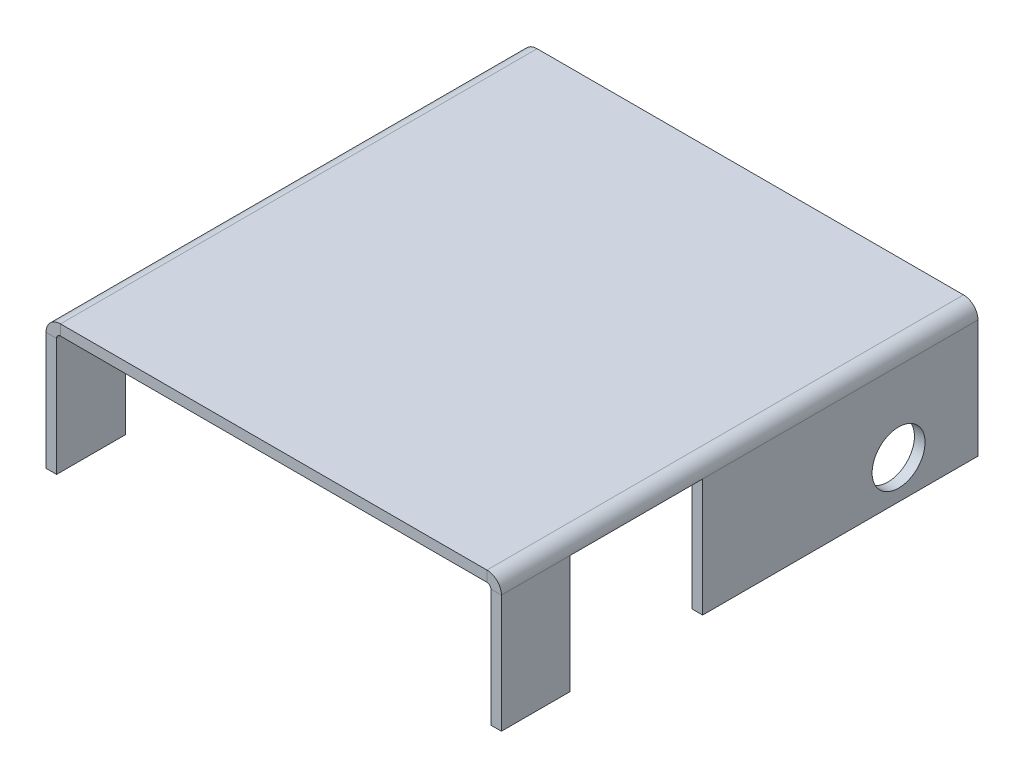
ISO-10303-21;
HEADER;
FILE_DESCRIPTION(('STEP AP214'),'2;1');
FILE_NAME('part.step','',(''),(''),'','','');
FILE_SCHEMA(('AUTOMOTIVE_DESIGN { 1 0 10303 214 1 1 1 1 }'));
ENDSEC;
DATA;
#1=APPLICATION_CONTEXT('core data for automotive mechanical design processes');
#2=APPLICATION_PROTOCOL_DEFINITION('international standard','automotive_design',2000,#1);
#3=PRODUCT_CONTEXT('',#1,'mechanical');
#4=PRODUCT('Part','Part','',(#3));
#5=PRODUCT_RELATED_PRODUCT_CATEGORY('part','',(#4));
#6=PRODUCT_DEFINITION_FORMATION('','',#4);
#7=PRODUCT_DEFINITION_CONTEXT('part definition',#1,'design');
#8=PRODUCT_DEFINITION('design','',#6,#7);
#9=PRODUCT_DEFINITION_SHAPE('','',#8);
#10=(LENGTH_UNIT() NAMED_UNIT(*) SI_UNIT(.MILLI.,.METRE.));
#11=(NAMED_UNIT(*) PLANE_ANGLE_UNIT() SI_UNIT($,.RADIAN.));
#12=(NAMED_UNIT(*) SI_UNIT($,.STERADIAN.) SOLID_ANGLE_UNIT());
#13=UNCERTAINTY_MEASURE_WITH_UNIT(LENGTH_MEASURE(1.E-05),#10,'distance_accuracy_value','');
#14=(GEOMETRIC_REPRESENTATION_CONTEXT(3) GLOBAL_UNCERTAINTY_ASSIGNED_CONTEXT((#13)) GLOBAL_UNIT_ASSIGNED_CONTEXT((#10,
#11,#12)) REPRESENTATION_CONTEXT('',''));
#15=CARTESIAN_POINT('',(0.,0.,0.));
#16=DIRECTION('',(0.,0.,1.));
#17=DIRECTION('',(1.,0.,0.));
#18=AXIS2_PLACEMENT_3D('',#15,#16,#17);
#19=CARTESIAN_POINT('',(90.0168743777956,3.32870375304922E-13,0.));
#20=DIRECTION('',(-1.,0.,0.));
#21=DIRECTION('',(0.,-1.,0.));
#22=AXIS2_PLACEMENT_3D('',#19,#20,#21);
#23=PLANE('',#22);
#24=CARTESIAN_POINT('',(90.0168743777957,-17.7366000000002,-75.0175246000337));
#25=DIRECTION('',(-1.,0.,0.));
#26=DIRECTION('',(0.,-1.,0.));
#27=AXIS2_PLACEMENT_3D('',#24,#25,#26);
#28=CIRCLE('',#27,5.);
#29=CARTESIAN_POINT('',(90.0168743777957,-22.7366000000002,-75.0175246000337));
#30=VERTEX_POINT('',#29);
#31=EDGE_CURVE('E855',#30,#30,#28,.T.);
#32=ORIENTED_EDGE('',*,*,#31,.T.);
#33=EDGE_LOOP('',(#32));
#34=FACE_BOUND('',#33,.T.);
#35=DIRECTION('',(0.,0.,1.));
#36=VECTOR('',#35,1.);
#37=CARTESIAN_POINT('',(90.0168743777956,-2.7366,-90.0175246000337));
#38=LINE('',#37,#36);
#39=CARTESIAN_POINT('',(90.0168743777956,-2.7366,-38.0175246000338));
#40=VERTEX_POINT('',#39);
#41=CARTESIAN_POINT('',(90.0168743777956,-2.7366,-90.0175246000337));
#42=VERTEX_POINT('',#41);
#43=EDGE_CURVE('E320',#40,#42,#38,.F.);
#44=ORIENTED_EDGE('',*,*,#43,.F.);
#45=DIRECTION('',(0.,1.,0.));
#46=VECTOR('',#45,1.);
#47=CARTESIAN_POINT('',(90.0168743777957,-25.,-38.0175246000338));
#48=LINE('',#47,#46);
#49=CARTESIAN_POINT('',(90.0168743777957,-25.,-38.0175246000338));
#50=VERTEX_POINT('',#49);
#51=EDGE_CURVE('E485',#50,#40,#48,.T.);
#52=ORIENTED_EDGE('',*,*,#51,.F.);
#53=DIRECTION('',(0.,0.,-1.));
#54=VECTOR('',#53,1.);
#55=CARTESIAN_POINT('',(90.0168743777957,-25.,0.));
#56=LINE('',#55,#54);
#57=CARTESIAN_POINT('',(90.0168743777957,-25.,-90.0175246000337));
#58=VERTEX_POINT('',#57);
#59=EDGE_CURVE('E305',#50,#58,#56,.T.);
#60=ORIENTED_EDGE('',*,*,#59,.T.);
#61=DIRECTION('',(0.,1.,0.));
#62=VECTOR('',#61,1.);
#63=CARTESIAN_POINT('',(90.0168743777956,3.32870375304922E-13,-90.0175246000337));
#64=LINE('',#63,#62);
#65=EDGE_CURVE('E299',#58,#42,#64,.T.);
#66=ORIENTED_EDGE('',*,*,#65,.T.);
#67=EDGE_LOOP('',(#44,#52,#60,#66));
#68=FACE_BOUND('',#67,.T.);
#69=ADVANCED_FACE('F77',(#34,#68),#23,.F.);
#70=CARTESIAN_POINT('',(88.0168743777956,3.25887412627236E-13,0.));
#71=DIRECTION('',(-1.,0.,0.));
#72=DIRECTION('',(0.,-1.,0.));
#73=AXIS2_PLACEMENT_3D('',#70,#71,#72);
#74=PLANE('',#73);
#75=CARTESIAN_POINT('',(88.0168743777956,-17.7366000000002,-75.0175246000337));
#76=DIRECTION('',(-1.,0.,0.));
#77=DIRECTION('',(0.,-1.,0.));
#78=AXIS2_PLACEMENT_3D('',#75,#76,#77);
#79=CIRCLE('',#78,5.);
#80=CARTESIAN_POINT('',(88.0168743777956,-22.7366000000002,-75.0175246000337));
#81=VERTEX_POINT('',#80);
#82=EDGE_CURVE('E486',#81,#81,#79,.T.);
#83=ORIENTED_EDGE('',*,*,#82,.F.);
#84=EDGE_LOOP('',(#83));
#85=FACE_BOUND('',#84,.T.);
#86=DIRECTION('',(0.,-1.,0.));
#87=VECTOR('',#86,1.);
#88=CARTESIAN_POINT('',(88.0168743777956,3.25887412627236E-13,-38.0175246000338));
#89=LINE('',#88,#87);
#90=CARTESIAN_POINT('',(88.0168743777956,-2.73660000000001,-38.0175246000338));
#91=VERTEX_POINT('',#90);
#92=CARTESIAN_POINT('',(88.0168743777957,-25.,-38.0175246000338));
#93=VERTEX_POINT('',#92);
#94=EDGE_CURVE('E421',#91,#93,#89,.T.);
#95=ORIENTED_EDGE('',*,*,#94,.F.);
#96=DIRECTION('',(0.,0.,1.));
#97=VECTOR('',#96,1.);
#98=CARTESIAN_POINT('',(88.0168743777956,-2.73660000000001,-90.0175246000337));
#99=LINE('',#98,#97);
#100=CARTESIAN_POINT('',(88.0168743777956,-2.73660000000001,-90.0175246000337));
#101=VERTEX_POINT('',#100);
#102=EDGE_CURVE('E324',#101,#91,#99,.T.);
#103=ORIENTED_EDGE('',*,*,#102,.F.);
#104=DIRECTION('',(0.,-1.,0.));
#105=VECTOR('',#104,1.);
#106=CARTESIAN_POINT('',(88.0168743777956,-2.,-90.0175246000337));
#107=LINE('',#106,#105);
#108=CARTESIAN_POINT('',(88.0168743777957,-25.,-90.0175246000337));
#109=VERTEX_POINT('',#108);
#110=EDGE_CURVE('E308',#109,#101,#107,.F.);
#111=ORIENTED_EDGE('',*,*,#110,.F.);
#112=DIRECTION('',(0.,0.,1.));
#113=VECTOR('',#112,1.);
#114=CARTESIAN_POINT('',(88.0168743777957,-25.,-90.0175246000337));
#115=LINE('',#114,#113);
#116=EDGE_CURVE('E314',#93,#109,#115,.F.);
#117=ORIENTED_EDGE('',*,*,#116,.F.);
#118=EDGE_LOOP('',(#95,#103,#111,#117));
#119=FACE_BOUND('',#118,.T.);
#120=ADVANCED_FACE('F419',(#85,#119),#74,.T.);
#121=CARTESIAN_POINT('',(90.0168743777957,-25.,-90.0175246000337));
#122=DIRECTION('',(0.,1.,0.));
#123=DIRECTION('',(-1.,0.,0.));
#124=AXIS2_PLACEMENT_3D('',#121,#122,#123);
#125=PLANE('',#124);
#126=ORIENTED_EDGE('',*,*,#59,.F.);
#127=DIRECTION('',(1.,0.,0.));
#128=VECTOR('',#127,1.);
#129=CARTESIAN_POINT('',(4.01687437779551,-25.0000000000003,-38.0175246000337));
#130=LINE('',#129,#128);
#131=EDGE_CURVE('E430',#93,#50,#130,.T.);
#132=ORIENTED_EDGE('',*,*,#131,.F.);
#133=ORIENTED_EDGE('',*,*,#116,.T.);
#134=DIRECTION('',(-1.,0.,0.));
#135=VECTOR('',#134,1.);
#136=CARTESIAN_POINT('',(90.0168743777957,-25.,-90.0175246000337));
#137=LINE('',#136,#135);
#138=EDGE_CURVE('E296',#58,#109,#137,.T.);
#139=ORIENTED_EDGE('',*,*,#138,.F.);
#140=EDGE_LOOP('',(#126,#132,#133,#139));
#141=FACE_BOUND('',#140,.T.);
#142=ADVANCED_FACE('F428',(#141),#125,.F.);
#143=CARTESIAN_POINT('',(4.01687437779561,0.,0.));
#144=DIRECTION('',(1.,0.,0.));
#145=DIRECTION('',(0.,1.,0.));
#146=AXIS2_PLACEMENT_3D('',#143,#144,#145);
#147=PLANE('',#146);
#148=CARTESIAN_POINT('',(4.01687437779554,-17.7365999999999,-75.0175246000337));
#149=DIRECTION('',(-1.,0.,0.));
#150=DIRECTION('',(0.,-1.,0.));
#151=AXIS2_PLACEMENT_3D('',#148,#149,#150);
#152=CIRCLE('',#151,5.);
#153=CARTESIAN_POINT('',(4.01687437779552,-22.7365999999999,-75.0175246000337));
#154=VERTEX_POINT('',#153);
#155=EDGE_CURVE('E856',#154,#154,#152,.T.);
#156=ORIENTED_EDGE('',*,*,#155,.F.);
#157=EDGE_LOOP('',(#156));
#158=FACE_BOUND('',#157,.T.);
#159=DIRECTION('',(0.,0.,1.));
#160=VECTOR('',#159,1.);
#161=CARTESIAN_POINT('',(4.01687437779552,-25.,0.));
#162=LINE('',#161,#160);
#163=CARTESIAN_POINT('',(4.01687437779551,-25.,-90.0175246000337));
#164=VERTEX_POINT('',#163);
#165=CARTESIAN_POINT('',(4.01687437779551,-25.0000000000003,-38.0175246000337));
#166=VERTEX_POINT('',#165);
#167=EDGE_CURVE('E245',#164,#166,#162,.T.);
#168=ORIENTED_EDGE('',*,*,#167,.T.);
#169=DIRECTION('',(0.,1.,0.));
#170=VECTOR('',#169,1.);
#171=CARTESIAN_POINT('',(4.01687437779551,-25.0000000000003,-38.0175246000337));
#172=LINE('',#171,#170);
#173=CARTESIAN_POINT('',(4.01687437779542,-2.73660000000031,-38.0175246000337));
#174=VERTEX_POINT('',#173);
#175=EDGE_CURVE('E220',#166,#174,#172,.T.);
#176=ORIENTED_EDGE('',*,*,#175,.T.);
#177=DIRECTION('',(0.,0.,-1.));
#178=VECTOR('',#177,1.);
#179=CARTESIAN_POINT('',(4.0168743777956,-2.73659999999999,-0.0175246000337505));
#180=LINE('',#179,#178);
#181=CARTESIAN_POINT('',(4.01687437779559,-2.73659999999999,-90.0175246000337));
#182=VERTEX_POINT('',#181);
#183=EDGE_CURVE('E242',#182,#174,#180,.F.);
#184=ORIENTED_EDGE('',*,*,#183,.F.);
#185=DIRECTION('',(0.,-1.,0.));
#186=VECTOR('',#185,1.);
#187=CARTESIAN_POINT('',(4.0168743777956,0.,-90.0175246000337));
#188=LINE('',#187,#186);
#189=EDGE_CURVE('E457',#182,#164,#188,.T.);
#190=ORIENTED_EDGE('',*,*,#189,.T.);
#191=EDGE_LOOP('',(#168,#176,#184,#190));
#192=FACE_BOUND('',#191,.T.);
#193=ADVANCED_FACE('F241',(#158,#192),#147,.F.);
#194=CARTESIAN_POINT('',(6.01687437779561,0.,0.));
#195=DIRECTION('',(1.,0.,0.));
#196=DIRECTION('',(0.,1.,0.));
#197=AXIS2_PLACEMENT_3D('',#194,#195,#196);
#198=PLANE('',#197);
#199=CARTESIAN_POINT('',(6.01687437779554,-17.7365999999999,-75.0175246000337));
#200=DIRECTION('',(1.,0.,0.));
#201=DIRECTION('',(0.,1.,0.));
#202=AXIS2_PLACEMENT_3D('',#199,#200,#201);
#203=CIRCLE('',#202,5.);
#204=CARTESIAN_POINT('',(6.01687437779555,-12.7365999999999,-75.0175246000337));
#205=VERTEX_POINT('',#204);
#206=EDGE_CURVE('E81',#205,#205,#203,.T.);
#207=ORIENTED_EDGE('',*,*,#206,.F.);
#208=EDGE_LOOP('',(#207));
#209=FACE_BOUND('',#208,.T.);
#210=DIRECTION('',(0.,1.,0.));
#211=VECTOR('',#210,1.);
#212=CARTESIAN_POINT('',(6.0168743777956,0.,-38.0175246000337));
#213=LINE('',#212,#211);
#214=CARTESIAN_POINT('',(6.01687437779552,-25.0000000000003,-38.0175246000337));
#215=VERTEX_POINT('',#214);
#216=CARTESIAN_POINT('',(6.0168743777956,-2.7366000000003,-38.0175246000337));
#217=VERTEX_POINT('',#216);
#218=EDGE_CURVE('E223',#215,#217,#213,.T.);
#219=ORIENTED_EDGE('',*,*,#218,.F.);
#220=DIRECTION('',(0.,0.,-1.));
#221=VECTOR('',#220,1.);
#222=CARTESIAN_POINT('',(6.01687437779552,-25.,-0.0175246000337514));
#223=LINE('',#222,#221);
#224=CARTESIAN_POINT('',(6.01687437779551,-25.,-90.0175246000337));
#225=VERTEX_POINT('',#224);
#226=EDGE_CURVE('E461',#225,#215,#223,.F.);
#227=ORIENTED_EDGE('',*,*,#226,.F.);
#228=DIRECTION('',(0.,1.,0.));
#229=VECTOR('',#228,1.);
#230=CARTESIAN_POINT('',(6.01687437779551,-25.,-90.0175246000337));
#231=LINE('',#230,#229);
#232=CARTESIAN_POINT('',(6.0168743777956,-2.73659999999999,-90.0175246000337));
#233=VERTEX_POINT('',#232);
#234=EDGE_CURVE('E251',#233,#225,#231,.F.);
#235=ORIENTED_EDGE('',*,*,#234,.F.);
#236=DIRECTION('',(0.,0.,-1.));
#237=VECTOR('',#236,1.);
#238=CARTESIAN_POINT('',(6.0168743777956,-2.7366,-0.0175246000337507));
#239=LINE('',#238,#237);
#240=EDGE_CURVE('E264',#217,#233,#239,.T.);
#241=ORIENTED_EDGE('',*,*,#240,.F.);
#242=EDGE_LOOP('',(#219,#227,#235,#241));
#243=FACE_BOUND('',#242,.T.);
#244=ADVANCED_FACE('F656',(#209,#243),#198,.T.);
#245=CARTESIAN_POINT('',(4.01687437779552,-25.,-0.0175246000337511));
#246=DIRECTION('',(0.,1.,0.));
#247=DIRECTION('',(-1.,0.,0.));
#248=AXIS2_PLACEMENT_3D('',#245,#246,#247);
#249=PLANE('',#248);
#250=ORIENTED_EDGE('',*,*,#226,.T.);
#251=EDGE_CURVE('E434',#166,#215,#130,.T.);
#252=ORIENTED_EDGE('',*,*,#251,.F.);
#253=ORIENTED_EDGE('',*,*,#167,.F.);
#254=DIRECTION('',(1.,0.,0.));
#255=VECTOR('',#254,1.);
#256=CARTESIAN_POINT('',(4.01687437779551,-25.,-90.0175246000337));
#257=LINE('',#256,#255);
#258=EDGE_CURVE('E285',#164,#225,#257,.T.);
#259=ORIENTED_EDGE('',*,*,#258,.T.);
#260=EDGE_LOOP('',(#250,#252,#253,#259));
#261=FACE_BOUND('',#260,.T.);
#262=ADVANCED_FACE('F526',(#261),#249,.F.);
#263=CARTESIAN_POINT('',(0.,-2.,0.));
#264=DIRECTION('',(0.,1.,0.));
#265=DIRECTION('',(0.,0.,1.));
#266=AXIS2_PLACEMENT_3D('',#263,#264,#265);
#267=PLANE('',#266);
#268=DIRECTION('',(0.,0.,-1.));
#269=VECTOR('',#268,1.);
#270=CARTESIAN_POINT('',(6.75347437779559,-2.,-90.0175246000337));
#271=LINE('',#270,#269);
#272=CARTESIAN_POINT('',(6.75347437779559,-2.,-90.0175246000337));
#273=VERTEX_POINT('',#272);
#274=CARTESIAN_POINT('',(6.75347437779559,-2.,-0.0175246000337914));
#275=VERTEX_POINT('',#274);
#276=EDGE_CURVE('E280',#273,#275,#271,.F.);
#277=ORIENTED_EDGE('',*,*,#276,.F.);
#278=DIRECTION('',(-1.,0.,0.));
#279=VECTOR('',#278,1.);
#280=CARTESIAN_POINT('',(4.01687437779559,-2.,-90.0175246000338));
#281=LINE('',#280,#279);
#282=CARTESIAN_POINT('',(87.2802743777956,-2.00000000000002,-90.0175246000337));
#283=VERTEX_POINT('',#282);
#284=EDGE_CURVE('E13',#283,#273,#281,.T.);
#285=ORIENTED_EDGE('',*,*,#284,.F.);
#286=DIRECTION('',(0.,0.,1.));
#287=VECTOR('',#286,1.);
#288=CARTESIAN_POINT('',(87.2802743777956,-2.00000000000002,-0.0175246000337498));
#289=LINE('',#288,#287);
#290=CARTESIAN_POINT('',(87.2802743777956,-2.00000000000002,-0.0175246000337497));
#291=VERTEX_POINT('',#290);
#292=EDGE_CURVE('E343',#291,#283,#289,.F.);
#293=ORIENTED_EDGE('',*,*,#292,.F.);
#294=DIRECTION('',(1.,0.,0.));
#295=VECTOR('',#294,1.);
#296=CARTESIAN_POINT('',(4.0168743777956,-2.,-0.0175246000337498));
#297=LINE('',#296,#295);
#298=EDGE_CURVE('E86',#275,#291,#297,.T.);
#299=ORIENTED_EDGE('',*,*,#298,.F.);
#300=EDGE_LOOP('',(#277,#285,#293,#299));
#301=FACE_BOUND('',#300,.T.);
#302=ADVANCED_FACE('F376',(#301),#267,.F.);
#303=CARTESIAN_POINT('',(0.,0.,0.));
#304=DIRECTION('',(0.,1.,0.));
#305=DIRECTION('',(0.,0.,1.));
#306=AXIS2_PLACEMENT_3D('',#303,#304,#305);
#307=PLANE('',#306);
#308=DIRECTION('',(-1.,0.,0.));
#309=VECTOR('',#308,1.);
#310=CARTESIAN_POINT('',(4.01687437779559,0.,-90.0175246000338));
#311=LINE('',#310,#309);
#312=CARTESIAN_POINT('',(87.2802743777956,0.,-90.0175246000338));
#313=VERTEX_POINT('',#312);
#314=CARTESIAN_POINT('',(6.75347437779557,0.,-90.0175246000337));
#315=VERTEX_POINT('',#314);
#316=EDGE_CURVE('E353',#313,#315,#311,.T.);
#317=ORIENTED_EDGE('',*,*,#316,.T.);
#318=DIRECTION('',(0.,0.,-1.));
#319=VECTOR('',#318,1.);
#320=CARTESIAN_POINT('',(6.75347437779557,0.,-90.0175246000337));
#321=LINE('',#320,#319);
#322=CARTESIAN_POINT('',(6.75347437779559,0.,-0.0175246000337913));
#323=VERTEX_POINT('',#322);
#324=EDGE_CURVE('E269',#315,#323,#321,.F.);
#325=ORIENTED_EDGE('',*,*,#324,.T.);
#326=DIRECTION('',(1.,0.,0.));
#327=VECTOR('',#326,1.);
#328=CARTESIAN_POINT('',(4.0168743777956,0.,-0.0175246000337498));
#329=LINE('',#328,#327);
#330=CARTESIAN_POINT('',(87.2802743777956,0.,-0.0175246000337497));
#331=VERTEX_POINT('',#330);
#332=EDGE_CURVE('E350',#323,#331,#329,.T.);
#333=ORIENTED_EDGE('',*,*,#332,.T.);
#334=DIRECTION('',(0.,0.,1.));
#335=VECTOR('',#334,1.);
#336=CARTESIAN_POINT('',(87.2802743777956,0.,-0.0175246000337498));
#337=LINE('',#336,#335);
#338=EDGE_CURVE('E330',#331,#313,#337,.F.);
#339=ORIENTED_EDGE('',*,*,#338,.T.);
#340=EDGE_LOOP('',(#317,#325,#333,#339));
#341=FACE_BOUND('',#340,.T.);
#342=ADVANCED_FACE('F358',(#341),#307,.T.);
#343=CARTESIAN_POINT('',(4.01687437779559,-2.,-90.0175246000338));
#344=DIRECTION('',(0.,0.,-1.));
#345=DIRECTION('',(-1.,0.,0.));
#346=AXIS2_PLACEMENT_3D('',#343,#344,#345);
#347=PLANE('',#346);
#348=ORIENTED_EDGE('',*,*,#284,.T.);
#349=DIRECTION('',(0.,1.,0.));
#350=VECTOR('',#349,1.);
#351=CARTESIAN_POINT('',(6.75347437779559,-2.,-90.0175246000337));
#352=LINE('',#351,#350);
#353=EDGE_CURVE('E275',#273,#315,#352,.T.);
#354=ORIENTED_EDGE('',*,*,#353,.T.);
#355=ORIENTED_EDGE('',*,*,#316,.F.);
#356=DIRECTION('',(0.,1.,0.));
#357=VECTOR('',#356,1.);
#358=CARTESIAN_POINT('',(87.2802743777956,-2.00000000000002,-90.0175246000337));
#359=LINE('',#358,#357);
#360=EDGE_CURVE('E347',#283,#313,#359,.T.);
#361=ORIENTED_EDGE('',*,*,#360,.F.);
#362=EDGE_LOOP('',(#348,#354,#355,#361));
#363=FACE_BOUND('',#362,.T.);
#364=ADVANCED_FACE('F363',(#363),#347,.T.);
#365=CARTESIAN_POINT('',(4.0168743777956,-2.,-0.0175246000337498));
#366=DIRECTION('',(0.,0.,1.));
#367=DIRECTION('',(1.,0.,0.));
#368=AXIS2_PLACEMENT_3D('',#365,#366,#367);
#369=PLANE('',#368);
#370=DIRECTION('',(0.,1.,0.));
#371=VECTOR('',#370,1.);
#372=CARTESIAN_POINT('',(6.75347437779559,-2.,-0.0175246000337914));
#373=LINE('',#372,#371);
#374=EDGE_CURVE('E286',#275,#323,#373,.T.);
#375=ORIENTED_EDGE('',*,*,#374,.F.);
#376=ORIENTED_EDGE('',*,*,#298,.T.);
#377=DIRECTION('',(0.,1.,0.));
#378=VECTOR('',#377,1.);
#379=CARTESIAN_POINT('',(87.2802743777956,-2.00000000000002,-0.0175246000337497));
#380=LINE('',#379,#378);
#381=EDGE_CURVE('E337',#291,#331,#380,.T.);
#382=ORIENTED_EDGE('',*,*,#381,.T.);
#383=ORIENTED_EDGE('',*,*,#332,.F.);
#384=EDGE_LOOP('',(#375,#376,#382,#383));
#385=FACE_BOUND('',#384,.T.);
#386=ADVANCED_FACE('F79',(#385),#369,.T.);
#387=CARTESIAN_POINT('',(87.2802743777956,-2.73660000000001,-90.0175246000337));
#388=DIRECTION('',(0.,0.,-1.));
#389=DIRECTION('',(-1.,0.,0.));
#390=AXIS2_PLACEMENT_3D('',#387,#388,#389);
#391=PLANE('',#390);
#392=DIRECTION('',(-1.,0.,0.));
#393=VECTOR('',#392,1.);
#394=CARTESIAN_POINT('',(90.0168743777956,-2.7366,-90.0175246000337));
#395=LINE('',#394,#393);
#396=EDGE_CURVE('E289',#101,#42,#395,.F.);
#397=ORIENTED_EDGE('',*,*,#396,.F.);
#398=CARTESIAN_POINT('',(87.2802743777956,-2.73660000000001,-90.0175246000337));
#399=DIRECTION('',(0.,0.,1.));
#400=DIRECTION('',(1.,0.,0.));
#401=AXIS2_PLACEMENT_3D('',#398,#399,#400);
#402=CIRCLE('',#401,0.73659999999999);
#403=EDGE_CURVE('E340',#283,#101,#402,.F.);
#404=ORIENTED_EDGE('',*,*,#403,.F.);
#405=ORIENTED_EDGE('',*,*,#360,.T.);
#406=CARTESIAN_POINT('',(87.2802743777956,-2.73660000000001,-90.0175246000337));
#407=DIRECTION('',(0.,0.,1.));
#408=DIRECTION('',(1.,0.,0.));
#409=AXIS2_PLACEMENT_3D('',#406,#407,#408);
#410=CIRCLE('',#409,2.73659999999999);
#411=EDGE_CURVE('E333',#313,#42,#410,.F.);
#412=ORIENTED_EDGE('',*,*,#411,.T.);
#413=EDGE_LOOP('',(#397,#404,#405,#412));
#414=FACE_BOUND('',#413,.T.);
#415=ADVANCED_FACE('F414',(#414),#391,.T.);
#416=CARTESIAN_POINT('',(87.2802743777956,-2.73660000000001,-0.0175246000337497));
#417=DIRECTION('',(0.,0.,-1.));
#418=DIRECTION('',(-1.,0.,0.));
#419=AXIS2_PLACEMENT_3D('',#416,#417,#418);
#420=PLANE('',#419);
#421=CARTESIAN_POINT('',(87.2802743777956,-2.73660000000001,-0.0175246000337497));
#422=DIRECTION('',(0.,0.,1.));
#423=DIRECTION('',(1.,0.,0.));
#424=AXIS2_PLACEMENT_3D('',#421,#422,#423);
#425=CIRCLE('',#424,0.73659999999999);
#426=CARTESIAN_POINT('',(88.0168743777956,-2.73660000000001,-0.0175246000337497));
#427=VERTEX_POINT('',#426);
#428=EDGE_CURVE('E295',#427,#291,#425,.T.);
#429=ORIENTED_EDGE('',*,*,#428,.F.);
#430=DIRECTION('',(-1.,0.,0.));
#431=VECTOR('',#430,1.);
#432=CARTESIAN_POINT('',(88.0168743777956,-2.73660000000001,-0.0175246000337498));
#433=LINE('',#432,#431);
#434=CARTESIAN_POINT('',(90.0168743777956,-2.7366,-0.0175246000337499));
#435=VERTEX_POINT('',#434);
#436=EDGE_CURVE('E321',#427,#435,#433,.F.);
#437=ORIENTED_EDGE('',*,*,#436,.T.);
#438=CARTESIAN_POINT('',(87.2802743777956,-2.73660000000001,-0.0175246000337497));
#439=DIRECTION('',(0.,0.,1.));
#440=DIRECTION('',(1.,0.,0.));
#441=AXIS2_PLACEMENT_3D('',#438,#439,#440);
#442=CIRCLE('',#441,2.73659999999999);
#443=EDGE_CURVE('E334',#435,#331,#442,.T.);
#444=ORIENTED_EDGE('',*,*,#443,.T.);
#445=ORIENTED_EDGE('',*,*,#381,.F.);
#446=EDGE_LOOP('',(#429,#437,#444,#445));
#447=FACE_BOUND('',#446,.T.);
#448=ADVANCED_FACE('F383',(#447),#420,.F.);
#449=CARTESIAN_POINT('',(87.2802743777956,-2.73660000000001,-0.0175246000337498));
#450=DIRECTION('',(0.,0.,1.));
#451=DIRECTION('',(1.,0.,0.));
#452=AXIS2_PLACEMENT_3D('',#449,#450,#451);
#453=CYLINDRICAL_SURFACE('',#452,2.73659999999999);
#454=ORIENTED_EDGE('',*,*,#338,.F.);
#455=ORIENTED_EDGE('',*,*,#443,.F.);
#456=CARTESIAN_POINT('',(90.0168743777956,-2.7366,-13.0175246000337));
#457=VERTEX_POINT('',#456);
#458=EDGE_CURVE('E317',#435,#457,#38,.F.);
#459=ORIENTED_EDGE('',*,*,#458,.T.);
#460=DIRECTION('',(0.,0.,1.));
#461=VECTOR('',#460,1.);
#462=CARTESIAN_POINT('',(90.0168743777956,-2.7366,-38.0175246000338));
#463=LINE('',#462,#461);
#464=EDGE_CURVE('E411',#40,#457,#463,.T.);
#465=ORIENTED_EDGE('',*,*,#464,.F.);
#466=ORIENTED_EDGE('',*,*,#43,.T.);
#467=ORIENTED_EDGE('',*,*,#411,.F.);
#468=EDGE_LOOP('',(#454,#455,#459,#465,#466,#467));
#469=FACE_BOUND('',#468,.T.);
#470=ADVANCED_FACE('F409',(#469),#453,.T.);
#471=CARTESIAN_POINT('',(87.2802743777956,-2.73660000000001,-0.0175246000337498));
#472=DIRECTION('',(0.,0.,1.));
#473=DIRECTION('',(1.,0.,0.));
#474=AXIS2_PLACEMENT_3D('',#471,#472,#473);
#475=CYLINDRICAL_SURFACE('',#474,0.73659999999999);
#476=ORIENTED_EDGE('',*,*,#292,.T.);
#477=ORIENTED_EDGE('',*,*,#403,.T.);
#478=ORIENTED_EDGE('',*,*,#102,.T.);
#479=DIRECTION('',(0.,0.,-1.));
#480=VECTOR('',#479,1.);
#481=CARTESIAN_POINT('',(88.0168743777956,-2.73660000000001,0.));
#482=LINE('',#481,#480);
#483=CARTESIAN_POINT('',(88.0168743777956,-2.73660000000001,-13.0175246000337));
#484=VERTEX_POINT('',#483);
#485=EDGE_CURVE('E268',#484,#91,#482,.T.);
#486=ORIENTED_EDGE('',*,*,#485,.F.);
#487=EDGE_CURVE('E327',#484,#427,#99,.T.);
#488=ORIENTED_EDGE('',*,*,#487,.T.);
#489=ORIENTED_EDGE('',*,*,#428,.T.);
#490=EDGE_LOOP('',(#476,#477,#478,#486,#488,#489));
#491=FACE_BOUND('',#490,.T.);
#492=ADVANCED_FACE('F386',(#491),#475,.F.);
#493=CARTESIAN_POINT('',(90.0168743777957,-25.,-0.0175246000337495));
#494=DIRECTION('',(0.,0.,-1.));
#495=DIRECTION('',(-1.,0.,0.));
#496=AXIS2_PLACEMENT_3D('',#493,#494,#495);
#497=PLANE('',#496);
#498=ORIENTED_EDGE('',*,*,#436,.F.);
#499=DIRECTION('',(0.,1.,0.));
#500=VECTOR('',#499,1.);
#501=CARTESIAN_POINT('',(88.0168743777957,-25.,-0.0175246000337492));
#502=LINE('',#501,#500);
#503=CARTESIAN_POINT('',(88.0168743777957,-25.,-0.0175246000337495));
#504=VERTEX_POINT('',#503);
#505=EDGE_CURVE('E315',#427,#504,#502,.F.);
#506=ORIENTED_EDGE('',*,*,#505,.T.);
#507=DIRECTION('',(-1.,0.,0.));
#508=VECTOR('',#507,1.);
#509=CARTESIAN_POINT('',(90.0168743777957,-25.,-0.0175246000337498));
#510=LINE('',#509,#508);
#511=CARTESIAN_POINT('',(90.0168743777957,-25.,-0.0175246000337496));
#512=VERTEX_POINT('',#511);
#513=EDGE_CURVE('E292',#512,#504,#510,.T.);
#514=ORIENTED_EDGE('',*,*,#513,.F.);
#515=DIRECTION('',(0.,-1.,0.));
#516=VECTOR('',#515,1.);
#517=CARTESIAN_POINT('',(90.0168743777956,3.32870140383854E-13,-0.0175246000337498));
#518=LINE('',#517,#516);
#519=EDGE_CURVE('E306',#435,#512,#518,.T.);
#520=ORIENTED_EDGE('',*,*,#519,.F.);
#521=EDGE_LOOP('',(#498,#506,#514,#520));
#522=FACE_BOUND('',#521,.T.);
#523=ADVANCED_FACE('F398',(#522),#497,.F.);
#524=CARTESIAN_POINT('',(90.0168743777956,-1.99999999999999,-90.0175246000337));
#525=DIRECTION('',(0.,0.,1.));
#526=DIRECTION('',(1.,0.,0.));
#527=AXIS2_PLACEMENT_3D('',#524,#525,#526);
#528=PLANE('',#527);
#529=ORIENTED_EDGE('',*,*,#396,.T.);
#530=ORIENTED_EDGE('',*,*,#65,.F.);
#531=ORIENTED_EDGE('',*,*,#138,.T.);
#532=ORIENTED_EDGE('',*,*,#110,.T.);
#533=EDGE_LOOP('',(#529,#530,#531,#532));
#534=FACE_BOUND('',#533,.T.);
#535=ADVANCED_FACE('F423',(#534),#528,.F.);
#536=CARTESIAN_POINT('',(90.0168743777957,-25.,-13.0175246000337));
#537=VERTEX_POINT('',#536);
#538=EDGE_CURVE('E302',#512,#537,#56,.T.);
#539=ORIENTED_EDGE('',*,*,#538,.T.);
#540=DIRECTION('',(0.,-1.,0.));
#541=VECTOR('',#540,1.);
#542=CARTESIAN_POINT('',(90.0168743777957,-25.,-13.0175246000337));
#543=LINE('',#542,#541);
#544=EDGE_CURVE('E94',#457,#537,#543,.T.);
#545=ORIENTED_EDGE('',*,*,#544,.F.);
#546=ORIENTED_EDGE('',*,*,#458,.F.);
#547=ORIENTED_EDGE('',*,*,#519,.T.);
#548=EDGE_LOOP('',(#539,#545,#546,#547));
#549=FACE_BOUND('',#548,.T.);
#550=ADVANCED_FACE('F405',(#549),#23,.F.);
#551=DIRECTION('',(0.,1.,0.));
#552=VECTOR('',#551,1.);
#553=CARTESIAN_POINT('',(88.0168743777956,3.24873110879848E-13,-13.0175246000337));
#554=LINE('',#553,#552);
#555=CARTESIAN_POINT('',(88.0168743777957,-25.,-13.0175246000337));
#556=VERTEX_POINT('',#555);
#557=EDGE_CURVE('E395',#556,#484,#554,.T.);
#558=ORIENTED_EDGE('',*,*,#557,.F.);
#559=EDGE_CURVE('E311',#504,#556,#115,.F.);
#560=ORIENTED_EDGE('',*,*,#559,.F.);
#561=ORIENTED_EDGE('',*,*,#505,.F.);
#562=ORIENTED_EDGE('',*,*,#487,.F.);
#563=EDGE_LOOP('',(#558,#560,#561,#562));
#564=FACE_BOUND('',#563,.T.);
#565=ADVANCED_FACE('F393',(#564),#74,.T.);
#566=ORIENTED_EDGE('',*,*,#559,.T.);
#567=DIRECTION('',(1.,0.,0.));
#568=VECTOR('',#567,1.);
#569=CARTESIAN_POINT('',(4.01687437779551,-25.0000000000003,-13.0175246000337));
#570=LINE('',#569,#568);
#571=EDGE_CURVE('E403',#556,#537,#570,.T.);
#572=ORIENTED_EDGE('',*,*,#571,.T.);
#573=ORIENTED_EDGE('',*,*,#538,.F.);
#574=ORIENTED_EDGE('',*,*,#513,.T.);
#575=EDGE_LOOP('',(#566,#572,#573,#574));
#576=FACE_BOUND('',#575,.T.);
#577=ADVANCED_FACE('F402',(#576),#125,.F.);
#578=CARTESIAN_POINT('',(6.75347437779559,-2.7366,-0.0175246000337775));
#579=DIRECTION('',(0.,0.,1.));
#580=DIRECTION('',(1.,0.,0.));
#581=AXIS2_PLACEMENT_3D('',#578,#579,#580);
#582=PLANE('',#581);
#583=DIRECTION('',(1.,0.,0.));
#584=VECTOR('',#583,1.);
#585=CARTESIAN_POINT('',(4.0168743777956,-2.73659999999999,-0.0175246000337498));
#586=LINE('',#585,#584);
#587=CARTESIAN_POINT('',(6.0168743777956,-2.73659999999999,-0.0175246000337914));
#588=VERTEX_POINT('',#587);
#589=CARTESIAN_POINT('',(4.0168743777956,-2.73659999999999,-0.0175246000338192));
#590=VERTEX_POINT('',#589);
#591=EDGE_CURVE('E265',#588,#590,#586,.F.);
#592=ORIENTED_EDGE('',*,*,#591,.F.);
#593=CARTESIAN_POINT('',(6.75347437779559,-2.7366,-0.0175246000337775));
#594=DIRECTION('',(0.,0.,-1.));
#595=DIRECTION('',(-1.,0.,0.));
#596=AXIS2_PLACEMENT_3D('',#593,#594,#595);
#597=CIRCLE('',#596,0.736599999999994);
#598=EDGE_CURVE('E277',#275,#588,#597,.F.);
#599=ORIENTED_EDGE('',*,*,#598,.F.);
#600=ORIENTED_EDGE('',*,*,#374,.T.);
#601=CARTESIAN_POINT('',(6.75347437779559,-2.7366,-0.0175246000338192));
#602=DIRECTION('',(0.,0.,-1.));
#603=DIRECTION('',(-1.,0.,0.));
#604=AXIS2_PLACEMENT_3D('',#601,#602,#603);
#605=CIRCLE('',#604,2.73659999999999);
#606=EDGE_CURVE('E272',#323,#590,#605,.F.);
#607=ORIENTED_EDGE('',*,*,#606,.T.);
#608=EDGE_LOOP('',(#592,#599,#600,#607));
#609=FACE_BOUND('',#608,.T.);
#610=ADVANCED_FACE('F478',(#609),#582,.T.);
#611=CARTESIAN_POINT('',(6.75347437779559,-2.7366,-90.0175246000337));
#612=DIRECTION('',(0.,0.,1.));
#613=DIRECTION('',(1.,0.,0.));
#614=AXIS2_PLACEMENT_3D('',#611,#612,#613);
#615=PLANE('',#614);
#616=CARTESIAN_POINT('',(6.75347437779559,-2.7366,-90.0175246000337));
#617=DIRECTION('',(0.,0.,-1.));
#618=DIRECTION('',(-1.,0.,0.));
#619=AXIS2_PLACEMENT_3D('',#616,#617,#618);
#620=CIRCLE('',#619,0.736599999999994);
#621=EDGE_CURVE('E282',#233,#273,#620,.T.);
#622=ORIENTED_EDGE('',*,*,#621,.F.);
#623=DIRECTION('',(1.,0.,0.));
#624=VECTOR('',#623,1.);
#625=CARTESIAN_POINT('',(6.01687437779559,-2.73659999999999,-90.0175246000337));
#626=LINE('',#625,#624);
#627=EDGE_CURVE('E256',#233,#182,#626,.F.);
#628=ORIENTED_EDGE('',*,*,#627,.T.);
#629=CARTESIAN_POINT('',(6.75347437779559,-2.7366,-90.0175246000337));
#630=DIRECTION('',(0.,0.,-1.));
#631=DIRECTION('',(-1.,0.,0.));
#632=AXIS2_PLACEMENT_3D('',#629,#630,#631);
#633=CIRCLE('',#632,2.73659999999999);
#634=EDGE_CURVE('E249',#182,#315,#633,.T.);
#635=ORIENTED_EDGE('',*,*,#634,.T.);
#636=ORIENTED_EDGE('',*,*,#353,.F.);
#637=EDGE_LOOP('',(#622,#628,#635,#636));
#638=FACE_BOUND('',#637,.T.);
#639=ADVANCED_FACE('F367',(#638),#615,.F.);
#640=CARTESIAN_POINT('',(6.75347437779559,-2.7366,-90.0175246000337));
#641=DIRECTION('',(0.,0.,-1.));
#642=DIRECTION('',(-1.,0.,0.));
#643=AXIS2_PLACEMENT_3D('',#640,#641,#642);
#644=CYLINDRICAL_SURFACE('',#643,2.73659999999999);
#645=ORIENTED_EDGE('',*,*,#324,.F.);
#646=ORIENTED_EDGE('',*,*,#634,.F.);
#647=ORIENTED_EDGE('',*,*,#183,.T.);
#648=DIRECTION('',(0.,0.,1.));
#649=VECTOR('',#648,1.);
#650=CARTESIAN_POINT('',(4.01687437779542,-2.73660000000031,-38.0175246000337));
#651=LINE('',#650,#649);
#652=CARTESIAN_POINT('',(4.01687437779544,-2.73660000000031,-13.0175246000337));
#653=VERTEX_POINT('',#652);
#654=EDGE_CURVE('E230',#174,#653,#651,.T.);
#655=ORIENTED_EDGE('',*,*,#654,.T.);
#656=EDGE_CURVE('E252',#653,#590,#180,.F.);
#657=ORIENTED_EDGE('',*,*,#656,.T.);
#658=ORIENTED_EDGE('',*,*,#606,.F.);
#659=EDGE_LOOP('',(#645,#646,#647,#655,#657,#658));
#660=FACE_BOUND('',#659,.T.);
#661=ADVANCED_FACE('F247',(#660),#644,.T.);
#662=CARTESIAN_POINT('',(6.75347437779559,-2.7366,-90.0175246000337));
#663=DIRECTION('',(0.,0.,-1.));
#664=DIRECTION('',(-1.,0.,0.));
#665=AXIS2_PLACEMENT_3D('',#662,#663,#664);
#666=CYLINDRICAL_SURFACE('',#665,0.736599999999994);
#667=ORIENTED_EDGE('',*,*,#276,.T.);
#668=ORIENTED_EDGE('',*,*,#598,.T.);
#669=CARTESIAN_POINT('',(6.0168743777956,-2.7366000000003,-13.0175246000337));
#670=VERTEX_POINT('',#669);
#671=EDGE_CURVE('E260',#588,#670,#239,.T.);
#672=ORIENTED_EDGE('',*,*,#671,.T.);
#673=EDGE_CURVE('E263',#670,#217,#239,.T.);
#674=ORIENTED_EDGE('',*,*,#673,.T.);
#675=ORIENTED_EDGE('',*,*,#240,.T.);
#676=ORIENTED_EDGE('',*,*,#621,.T.);
#677=EDGE_LOOP('',(#667,#668,#672,#674,#675,#676));
#678=FACE_BOUND('',#677,.T.);
#679=ADVANCED_FACE('F371',(#678),#666,.F.);
#680=CARTESIAN_POINT('',(4.01687437779551,-25.,-90.0175246000337));
#681=DIRECTION('',(0.,0.,1.));
#682=DIRECTION('',(1.,0.,0.));
#683=AXIS2_PLACEMENT_3D('',#680,#681,#682);
#684=PLANE('',#683);
#685=ORIENTED_EDGE('',*,*,#627,.F.);
#686=ORIENTED_EDGE('',*,*,#234,.T.);
#687=ORIENTED_EDGE('',*,*,#258,.F.);
#688=ORIENTED_EDGE('',*,*,#189,.F.);
#689=EDGE_LOOP('',(#685,#686,#687,#688));
#690=FACE_BOUND('',#689,.T.);
#691=ADVANCED_FACE('F621',(#690),#684,.F.);
#692=CARTESIAN_POINT('',(4.0168743777956,-1.99999999999999,-0.0175246000337498));
#693=DIRECTION('',(0.,0.,-1.));
#694=DIRECTION('',(-1.,0.,0.));
#695=AXIS2_PLACEMENT_3D('',#692,#693,#694);
#696=PLANE('',#695);
#697=ORIENTED_EDGE('',*,*,#591,.T.);
#698=DIRECTION('',(0.,1.,0.));
#699=VECTOR('',#698,1.);
#700=CARTESIAN_POINT('',(4.01687437779561,0.,-0.0175246000337497));
#701=LINE('',#700,#699);
#702=CARTESIAN_POINT('',(4.01687437779552,-25.,-0.0175246000337511));
#703=VERTEX_POINT('',#702);
#704=EDGE_CURVE('E452',#703,#590,#701,.T.);
#705=ORIENTED_EDGE('',*,*,#704,.F.);
#706=DIRECTION('',(1.,0.,0.));
#707=VECTOR('',#706,1.);
#708=CARTESIAN_POINT('',(4.01687437779552,-25.,-0.0175246000337511));
#709=LINE('',#708,#707);
#710=CARTESIAN_POINT('',(6.01687437779552,-25.,-0.0175246000337514));
#711=VERTEX_POINT('',#710);
#712=EDGE_CURVE('E449',#703,#711,#709,.T.);
#713=ORIENTED_EDGE('',*,*,#712,.T.);
#714=DIRECTION('',(0.,-1.,0.));
#715=VECTOR('',#714,1.);
#716=CARTESIAN_POINT('',(6.0168743777956,-2.,-0.01752460003375));
#717=LINE('',#716,#715);
#718=EDGE_CURVE('E459',#711,#588,#717,.F.);
#719=ORIENTED_EDGE('',*,*,#718,.T.);
#720=EDGE_LOOP('',(#697,#705,#713,#719));
#721=FACE_BOUND('',#720,.T.);
#722=ADVANCED_FACE('F474',(#721),#696,.F.);
#723=ORIENTED_EDGE('',*,*,#656,.F.);
#724=DIRECTION('',(0.,-1.,0.));
#725=VECTOR('',#724,1.);
#726=CARTESIAN_POINT('',(4.01687437779551,-25.0000000000003,-13.0175246000337));
#727=LINE('',#726,#725);
#728=CARTESIAN_POINT('',(4.01687437779551,-25.0000000000003,-13.0175246000337));
#729=VERTEX_POINT('',#728);
#730=EDGE_CURVE('E236',#653,#729,#727,.T.);
#731=ORIENTED_EDGE('',*,*,#730,.T.);
#732=EDGE_CURVE('E456',#729,#703,#162,.T.);
#733=ORIENTED_EDGE('',*,*,#732,.T.);
#734=ORIENTED_EDGE('',*,*,#704,.T.);
#735=EDGE_LOOP('',(#723,#731,#733,#734));
#736=FACE_BOUND('',#735,.T.);
#737=ADVANCED_FACE('F481',(#736),#147,.F.);
#738=DIRECTION('',(0.,-1.,0.));
#739=VECTOR('',#738,1.);
#740=CARTESIAN_POINT('',(6.01687437779561,0.,-13.0175246000337));
#741=LINE('',#740,#739);
#742=CARTESIAN_POINT('',(6.01687437779552,-25.,-13.0175246000337));
#743=VERTEX_POINT('',#742);
#744=EDGE_CURVE('E102',#670,#743,#741,.T.);
#745=ORIENTED_EDGE('',*,*,#744,.F.);
#746=ORIENTED_EDGE('',*,*,#671,.F.);
#747=ORIENTED_EDGE('',*,*,#718,.F.);
#748=EDGE_CURVE('E254',#743,#711,#223,.F.);
#749=ORIENTED_EDGE('',*,*,#748,.F.);
#750=EDGE_LOOP('',(#745,#746,#747,#749));
#751=FACE_BOUND('',#750,.T.);
#752=ADVANCED_FACE('F476',(#751),#198,.T.);
#753=ORIENTED_EDGE('',*,*,#732,.F.);
#754=EDGE_CURVE('E435',#729,#743,#570,.T.);
#755=ORIENTED_EDGE('',*,*,#754,.T.);
#756=ORIENTED_EDGE('',*,*,#748,.T.);
#757=ORIENTED_EDGE('',*,*,#712,.F.);
#758=EDGE_LOOP('',(#753,#755,#756,#757));
#759=FACE_BOUND('',#758,.T.);
#760=ADVANCED_FACE('F469',(#759),#249,.F.);
#761=CARTESIAN_POINT('',(4.01687437779551,-25.0000000000003,-13.0175246000337));
#762=DIRECTION('',(0.,0.,1.));
#763=DIRECTION('',(1.,0.,0.));
#764=AXIS2_PLACEMENT_3D('',#761,#762,#763);
#765=PLANE('',#764);
#766=ORIENTED_EDGE('',*,*,#744,.T.);
#767=ORIENTED_EDGE('',*,*,#754,.F.);
#768=ORIENTED_EDGE('',*,*,#730,.F.);
#769=DIRECTION('',(1.,0.,0.));
#770=VECTOR('',#769,1.);
#771=CARTESIAN_POINT('',(4.01687437779544,-2.73660000000031,-13.0175246000337));
#772=LINE('',#771,#770);
#773=EDGE_CURVE('E232',#653,#670,#772,.T.);
#774=ORIENTED_EDGE('',*,*,#773,.T.);
#775=EDGE_LOOP('',(#766,#767,#768,#774));
#776=FACE_BOUND('',#775,.T.);
#777=ADVANCED_FACE('F664',(#776),#765,.F.);
#778=CARTESIAN_POINT('',(4.01687437779551,-25.0000000000003,-38.0175246000337));
#779=DIRECTION('',(0.,0.,-1.));
#780=DIRECTION('',(-1.,0.,0.));
#781=AXIS2_PLACEMENT_3D('',#778,#779,#780);
#782=PLANE('',#781);
#783=ORIENTED_EDGE('',*,*,#218,.T.);
#784=DIRECTION('',(1.,0.,0.));
#785=VECTOR('',#784,1.);
#786=CARTESIAN_POINT('',(4.01687437779542,-2.73660000000031,-38.0175246000337));
#787=LINE('',#786,#785);
#788=EDGE_CURVE('E216',#174,#217,#787,.T.);
#789=ORIENTED_EDGE('',*,*,#788,.F.);
#790=ORIENTED_EDGE('',*,*,#175,.F.);
#791=ORIENTED_EDGE('',*,*,#251,.T.);
#792=EDGE_LOOP('',(#783,#789,#790,#791));
#793=FACE_BOUND('',#792,.T.);
#794=ADVANCED_FACE('F218',(#793),#782,.F.);
#795=CARTESIAN_POINT('',(4.01687437779542,-2.73660000000031,-38.0175246000337));
#796=DIRECTION('',(0.,1.,0.));
#797=DIRECTION('',(-1.,0.,0.));
#798=AXIS2_PLACEMENT_3D('',#795,#796,#797);
#799=PLANE('',#798);
#800=ORIENTED_EDGE('',*,*,#673,.F.);
#801=ORIENTED_EDGE('',*,*,#773,.F.);
#802=ORIENTED_EDGE('',*,*,#654,.F.);
#803=ORIENTED_EDGE('',*,*,#788,.T.);
#804=EDGE_LOOP('',(#800,#801,#802,#803));
#805=FACE_BOUND('',#804,.T.);
#806=ADVANCED_FACE('F231',(#805),#799,.F.);
#807=ORIENTED_EDGE('',*,*,#485,.T.);
#808=EDGE_CURVE('E227',#91,#40,#787,.T.);
#809=ORIENTED_EDGE('',*,*,#808,.T.);
#810=ORIENTED_EDGE('',*,*,#464,.T.);
#811=EDGE_CURVE('E226',#484,#457,#772,.T.);
#812=ORIENTED_EDGE('',*,*,#811,.F.);
#813=EDGE_LOOP('',(#807,#809,#810,#812));
#814=FACE_BOUND('',#813,.T.);
#815=ADVANCED_FACE('F489',(#814),#799,.F.);
#816=ORIENTED_EDGE('',*,*,#94,.T.);
#817=ORIENTED_EDGE('',*,*,#131,.T.);
#818=ORIENTED_EDGE('',*,*,#51,.T.);
#819=ORIENTED_EDGE('',*,*,#808,.F.);
#820=EDGE_LOOP('',(#816,#817,#818,#819));
#821=FACE_BOUND('',#820,.T.);
#822=ADVANCED_FACE('F491',(#821),#782,.F.);
#823=ORIENTED_EDGE('',*,*,#557,.T.);
#824=ORIENTED_EDGE('',*,*,#811,.T.);
#825=ORIENTED_EDGE('',*,*,#544,.T.);
#826=ORIENTED_EDGE('',*,*,#571,.F.);
#827=EDGE_LOOP('',(#823,#824,#825,#826));
#828=FACE_BOUND('',#827,.T.);
#829=ADVANCED_FACE('F721',(#828),#765,.F.);
#830=CARTESIAN_POINT('',(90.0168743777957,-17.7366000000002,-75.0175246000337));
#831=DIRECTION('',(-1.,0.,0.));
#832=DIRECTION('',(0.,-1.,0.));
#833=AXIS2_PLACEMENT_3D('',#830,#831,#832);
#834=CYLINDRICAL_SURFACE('',#833,5.);
#835=ORIENTED_EDGE('',*,*,#206,.T.);
#836=EDGE_LOOP('',(#835));
#837=FACE_BOUND('',#836,.T.);
#838=ORIENTED_EDGE('',*,*,#155,.T.);
#839=EDGE_LOOP('',(#838));
#840=FACE_BOUND('',#839,.T.);
#841=ADVANCED_FACE('F759',(#837,#840),#834,.F.);
#842=ORIENTED_EDGE('',*,*,#82,.T.);
#843=EDGE_LOOP('',(#842));
#844=FACE_BOUND('',#843,.T.);
#845=ORIENTED_EDGE('',*,*,#31,.F.);
#846=EDGE_LOOP('',(#845));
#847=FACE_BOUND('',#846,.T.);
#848=ADVANCED_FACE('F766',(#844,#847),#834,.F.);
#849=CLOSED_SHELL('',(#69,#120,#142,#193,#244,#262,#302,#342,#364,#386,#415,#448,#470,#492,#523,
#535,#550,#565,#577,#610,#639,#661,#679,#691,#722,#737,#752,#760,#777,#794,#806,#815,#822,#829,
#841,#848));
#850=MANIFOLD_SOLID_BREP('B2',#849);
#851=ADVANCED_BREP_SHAPE_REPRESENTATION('',(#18,#850),#14);
#852=SHAPE_DEFINITION_REPRESENTATION(#9,#851);
ENDSEC;
END-ISO-10303-21;
